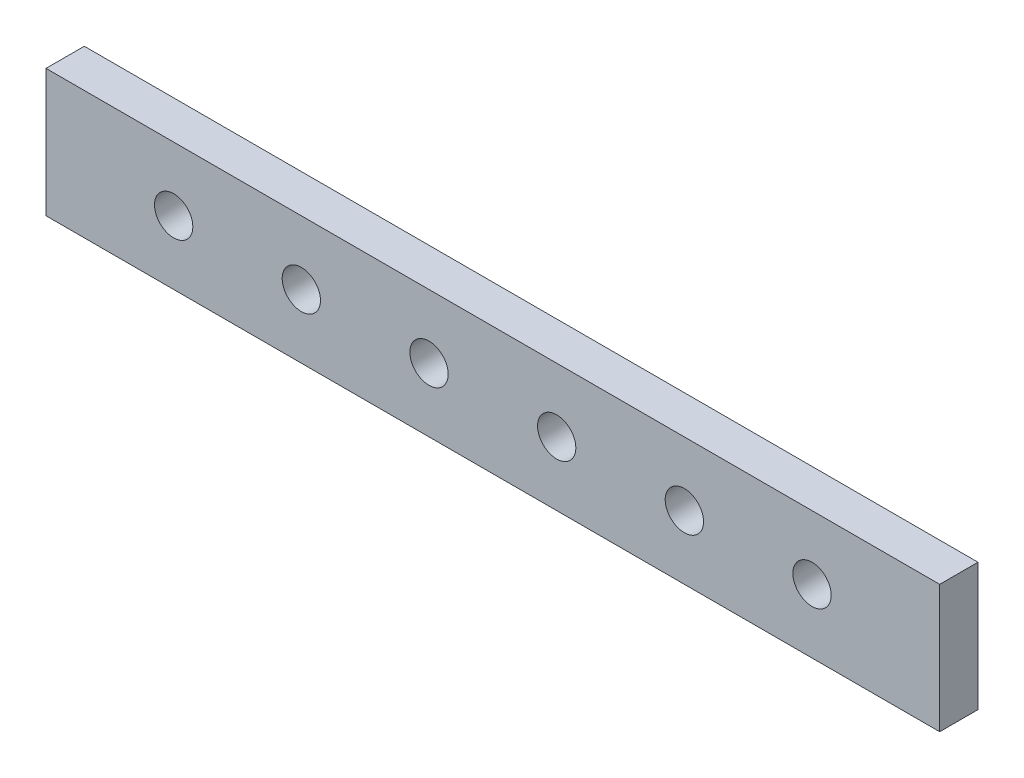
ISO-10303-21;
HEADER;
FILE_DESCRIPTION(('STEP AP214'),'2;1');
FILE_NAME('part.step','',(''),(''),'','','');
FILE_SCHEMA(('AUTOMOTIVE_DESIGN { 1 0 10303 214 1 1 1 1 }'));
ENDSEC;
DATA;
#1=APPLICATION_CONTEXT('core data for automotive mechanical design processes');
#2=APPLICATION_PROTOCOL_DEFINITION('international standard','automotive_design',2000,#1);
#3=PRODUCT_CONTEXT('',#1,'mechanical');
#4=PRODUCT('Part','Part','',(#3));
#5=PRODUCT_RELATED_PRODUCT_CATEGORY('part','',(#4));
#6=PRODUCT_DEFINITION_FORMATION('','',#4);
#7=PRODUCT_DEFINITION_CONTEXT('part definition',#1,'design');
#8=PRODUCT_DEFINITION('design','',#6,#7);
#9=PRODUCT_DEFINITION_SHAPE('','',#8);
#10=(LENGTH_UNIT() NAMED_UNIT(*) SI_UNIT(.MILLI.,.METRE.));
#11=(NAMED_UNIT(*) PLANE_ANGLE_UNIT() SI_UNIT($,.RADIAN.));
#12=(NAMED_UNIT(*) SI_UNIT($,.STERADIAN.) SOLID_ANGLE_UNIT());
#13=UNCERTAINTY_MEASURE_WITH_UNIT(LENGTH_MEASURE(1.E-05),#10,'distance_accuracy_value','');
#14=(GEOMETRIC_REPRESENTATION_CONTEXT(3) GLOBAL_UNCERTAINTY_ASSIGNED_CONTEXT((#13)) GLOBAL_UNIT_ASSIGNED_CONTEXT((#10,
#11,#12)) REPRESENTATION_CONTEXT('',''));
#15=CARTESIAN_POINT('',(0.,0.,0.));
#16=DIRECTION('',(0.,0.,1.));
#17=DIRECTION('',(1.,0.,0.));
#18=AXIS2_PLACEMENT_3D('',#15,#16,#17);
#19=CARTESIAN_POINT('',(0.,0.,3.));
#20=DIRECTION('',(0.,0.,1.));
#21=DIRECTION('',(1.,0.,0.));
#22=AXIS2_PLACEMENT_3D('',#19,#20,#21);
#23=PLANE('',#22);
#24=CARTESIAN_POINT('',(15.,0.,3.));
#25=DIRECTION('',(0.,0.,1.));
#26=DIRECTION('',(1.,0.,0.));
#27=AXIS2_PLACEMENT_3D('',#24,#25,#26);
#28=CIRCLE('',#27,1.5);
#29=CARTESIAN_POINT('',(16.5,0.,3.));
#30=VERTEX_POINT('',#29);
#31=EDGE_CURVE('E133',#30,#30,#28,.T.);
#32=ORIENTED_EDGE('',*,*,#31,.F.);
#33=EDGE_LOOP('',(#32));
#34=FACE_BOUND('',#33,.T.);
#35=CARTESIAN_POINT('',(-5.00000000000001,0.,3.));
#36=DIRECTION('',(0.,0.,1.));
#37=DIRECTION('',(1.,0.,0.));
#38=AXIS2_PLACEMENT_3D('',#35,#36,#37);
#39=CIRCLE('',#38,1.5);
#40=CARTESIAN_POINT('',(-3.50000000000001,0.,3.));
#41=VERTEX_POINT('',#40);
#42=EDGE_CURVE('E121',#41,#41,#39,.T.);
#43=ORIENTED_EDGE('',*,*,#42,.F.);
#44=EDGE_LOOP('',(#43));
#45=FACE_BOUND('',#44,.T.);
#46=CARTESIAN_POINT('',(-25.,0.,3.));
#47=DIRECTION('',(0.,0.,1.));
#48=DIRECTION('',(1.,0.,0.));
#49=AXIS2_PLACEMENT_3D('',#46,#47,#48);
#50=CIRCLE('',#49,1.5);
#51=CARTESIAN_POINT('',(-23.5,0.,3.));
#52=VERTEX_POINT('',#51);
#53=EDGE_CURVE('E100',#52,#52,#50,.T.);
#54=ORIENTED_EDGE('',*,*,#53,.F.);
#55=EDGE_LOOP('',(#54));
#56=FACE_BOUND('',#55,.T.);
#57=DIRECTION('',(0.,1.,0.));
#58=VECTOR('',#57,1.);
#59=CARTESIAN_POINT('',(35.,5.,3.));
#60=LINE('',#59,#58);
#61=CARTESIAN_POINT('',(35.,-5.,3.));
#62=VERTEX_POINT('',#61);
#63=CARTESIAN_POINT('',(35.,5.,3.));
#64=VERTEX_POINT('',#63);
#65=EDGE_CURVE('E85',#62,#64,#60,.T.);
#66=ORIENTED_EDGE('',*,*,#65,.T.);
#67=DIRECTION('',(-1.,0.,0.));
#68=VECTOR('',#67,1.);
#69=CARTESIAN_POINT('',(-35.,5.,3.));
#70=LINE('',#69,#68);
#71=CARTESIAN_POINT('',(-35.,5.,3.));
#72=VERTEX_POINT('',#71);
#73=EDGE_CURVE('E80',#64,#72,#70,.T.);
#74=ORIENTED_EDGE('',*,*,#73,.T.);
#75=DIRECTION('',(0.,-1.,0.));
#76=VECTOR('',#75,1.);
#77=CARTESIAN_POINT('',(-35.,5.,3.));
#78=LINE('',#77,#76);
#79=CARTESIAN_POINT('',(-35.,-5.,3.));
#80=VERTEX_POINT('',#79);
#81=EDGE_CURVE('E83',#72,#80,#78,.T.);
#82=ORIENTED_EDGE('',*,*,#81,.T.);
#83=DIRECTION('',(1.,0.,0.));
#84=VECTOR('',#83,1.);
#85=CARTESIAN_POINT('',(-35.,-5.,3.));
#86=LINE('',#85,#84);
#87=EDGE_CURVE('E50',#80,#62,#86,.T.);
#88=ORIENTED_EDGE('',*,*,#87,.T.);
#89=EDGE_LOOP('',(#66,#74,#82,#88));
#90=FACE_BOUND('',#89,.T.);
#91=CARTESIAN_POINT('',(-15.,0.,3.));
#92=DIRECTION('',(0.,0.,1.));
#93=DIRECTION('',(1.,0.,0.));
#94=AXIS2_PLACEMENT_3D('',#91,#92,#93);
#95=CIRCLE('',#94,1.5);
#96=CARTESIAN_POINT('',(-13.5,0.,3.));
#97=VERTEX_POINT('',#96);
#98=EDGE_CURVE('E115',#97,#97,#95,.T.);
#99=ORIENTED_EDGE('',*,*,#98,.F.);
#100=EDGE_LOOP('',(#99));
#101=FACE_BOUND('',#100,.T.);
#102=CARTESIAN_POINT('',(4.99999999999999,0.,3.));
#103=DIRECTION('',(0.,0.,1.));
#104=DIRECTION('',(1.,0.,0.));
#105=AXIS2_PLACEMENT_3D('',#102,#103,#104);
#106=CIRCLE('',#105,1.5);
#107=CARTESIAN_POINT('',(6.49999999999999,0.,3.));
#108=VERTEX_POINT('',#107);
#109=EDGE_CURVE('E127',#108,#108,#106,.T.);
#110=ORIENTED_EDGE('',*,*,#109,.F.);
#111=EDGE_LOOP('',(#110));
#112=FACE_BOUND('',#111,.T.);
#113=CARTESIAN_POINT('',(25.,0.,3.));
#114=DIRECTION('',(0.,0.,1.));
#115=DIRECTION('',(1.,0.,0.));
#116=AXIS2_PLACEMENT_3D('',#113,#114,#115);
#117=CIRCLE('',#116,1.5);
#118=CARTESIAN_POINT('',(26.5,0.,3.));
#119=VERTEX_POINT('',#118);
#120=EDGE_CURVE('E139',#119,#119,#117,.T.);
#121=ORIENTED_EDGE('',*,*,#120,.F.);
#122=EDGE_LOOP('',(#121));
#123=FACE_BOUND('',#122,.T.);
#124=ADVANCED_FACE('F33',(#34,#45,#56,#90,#101,#112,#123),#23,.T.);
#125=CARTESIAN_POINT('',(0.,0.,0.));
#126=DIRECTION('',(0.,0.,1.));
#127=DIRECTION('',(1.,0.,0.));
#128=AXIS2_PLACEMENT_3D('',#125,#126,#127);
#129=PLANE('',#128);
#130=DIRECTION('',(0.,1.,0.));
#131=VECTOR('',#130,1.);
#132=CARTESIAN_POINT('',(35.,5.,0.));
#133=LINE('',#132,#131);
#134=CARTESIAN_POINT('',(35.,-5.,0.));
#135=VERTEX_POINT('',#134);
#136=CARTESIAN_POINT('',(35.,5.,0.));
#137=VERTEX_POINT('',#136);
#138=EDGE_CURVE('E97',#135,#137,#133,.T.);
#139=ORIENTED_EDGE('',*,*,#138,.F.);
#140=DIRECTION('',(1.,0.,0.));
#141=VECTOR('',#140,1.);
#142=CARTESIAN_POINT('',(-35.,-5.,0.));
#143=LINE('',#142,#141);
#144=CARTESIAN_POINT('',(-35.,-5.,0.));
#145=VERTEX_POINT('',#144);
#146=EDGE_CURVE('E73',#145,#135,#143,.T.);
#147=ORIENTED_EDGE('',*,*,#146,.F.);
#148=DIRECTION('',(0.,-1.,0.));
#149=VECTOR('',#148,1.);
#150=CARTESIAN_POINT('',(-35.,5.,0.));
#151=LINE('',#150,#149);
#152=CARTESIAN_POINT('',(-35.,5.,0.));
#153=VERTEX_POINT('',#152);
#154=EDGE_CURVE('E67',#153,#145,#151,.T.);
#155=ORIENTED_EDGE('',*,*,#154,.F.);
#156=DIRECTION('',(-1.,0.,0.));
#157=VECTOR('',#156,1.);
#158=CARTESIAN_POINT('',(-35.,5.,0.));
#159=LINE('',#158,#157);
#160=EDGE_CURVE('E89',#137,#153,#159,.T.);
#161=ORIENTED_EDGE('',*,*,#160,.F.);
#162=EDGE_LOOP('',(#139,#147,#155,#161));
#163=FACE_BOUND('',#162,.T.);
#164=CARTESIAN_POINT('',(-25.,0.,0.));
#165=DIRECTION('',(0.,0.,1.));
#166=DIRECTION('',(1.,0.,0.));
#167=AXIS2_PLACEMENT_3D('',#164,#165,#166);
#168=CIRCLE('',#167,1.5);
#169=CARTESIAN_POINT('',(-23.5,0.,0.));
#170=VERTEX_POINT('',#169);
#171=EDGE_CURVE('E112',#170,#170,#168,.T.);
#172=ORIENTED_EDGE('',*,*,#171,.T.);
#173=EDGE_LOOP('',(#172));
#174=FACE_BOUND('',#173,.T.);
#175=CARTESIAN_POINT('',(-15.,0.,0.));
#176=DIRECTION('',(0.,0.,1.));
#177=DIRECTION('',(1.,0.,0.));
#178=AXIS2_PLACEMENT_3D('',#175,#176,#177);
#179=CIRCLE('',#178,1.5);
#180=CARTESIAN_POINT('',(-13.5,0.,0.));
#181=VERTEX_POINT('',#180);
#182=EDGE_CURVE('E118',#181,#181,#179,.T.);
#183=ORIENTED_EDGE('',*,*,#182,.T.);
#184=EDGE_LOOP('',(#183));
#185=FACE_BOUND('',#184,.T.);
#186=CARTESIAN_POINT('',(-5.00000000000001,0.,0.));
#187=DIRECTION('',(0.,0.,1.));
#188=DIRECTION('',(1.,0.,0.));
#189=AXIS2_PLACEMENT_3D('',#186,#187,#188);
#190=CIRCLE('',#189,1.5);
#191=CARTESIAN_POINT('',(-3.50000000000001,0.,0.));
#192=VERTEX_POINT('',#191);
#193=EDGE_CURVE('E124',#192,#192,#190,.T.);
#194=ORIENTED_EDGE('',*,*,#193,.T.);
#195=EDGE_LOOP('',(#194));
#196=FACE_BOUND('',#195,.T.);
#197=CARTESIAN_POINT('',(4.99999999999999,0.,0.));
#198=DIRECTION('',(0.,0.,1.));
#199=DIRECTION('',(1.,0.,0.));
#200=AXIS2_PLACEMENT_3D('',#197,#198,#199);
#201=CIRCLE('',#200,1.5);
#202=CARTESIAN_POINT('',(6.49999999999999,0.,0.));
#203=VERTEX_POINT('',#202);
#204=EDGE_CURVE('E130',#203,#203,#201,.T.);
#205=ORIENTED_EDGE('',*,*,#204,.T.);
#206=EDGE_LOOP('',(#205));
#207=FACE_BOUND('',#206,.T.);
#208=CARTESIAN_POINT('',(15.,0.,0.));
#209=DIRECTION('',(0.,0.,1.));
#210=DIRECTION('',(1.,0.,0.));
#211=AXIS2_PLACEMENT_3D('',#208,#209,#210);
#212=CIRCLE('',#211,1.5);
#213=CARTESIAN_POINT('',(16.5,0.,0.));
#214=VERTEX_POINT('',#213);
#215=EDGE_CURVE('E136',#214,#214,#212,.T.);
#216=ORIENTED_EDGE('',*,*,#215,.T.);
#217=EDGE_LOOP('',(#216));
#218=FACE_BOUND('',#217,.T.);
#219=CARTESIAN_POINT('',(25.,0.,0.));
#220=DIRECTION('',(0.,0.,1.));
#221=DIRECTION('',(1.,0.,0.));
#222=AXIS2_PLACEMENT_3D('',#219,#220,#221);
#223=CIRCLE('',#222,1.5);
#224=CARTESIAN_POINT('',(26.5,0.,0.));
#225=VERTEX_POINT('',#224);
#226=EDGE_CURVE('E142',#225,#225,#223,.T.);
#227=ORIENTED_EDGE('',*,*,#226,.T.);
#228=EDGE_LOOP('',(#227));
#229=FACE_BOUND('',#228,.T.);
#230=ADVANCED_FACE('F108',(#163,#174,#185,#196,#207,#218,#229),#129,.F.);
#231=CARTESIAN_POINT('',(35.,5.,3.));
#232=DIRECTION('',(-1.,0.,0.));
#233=DIRECTION('',(0.,0.,1.));
#234=AXIS2_PLACEMENT_3D('',#231,#232,#233);
#235=PLANE('',#234);
#236=ORIENTED_EDGE('',*,*,#138,.T.);
#237=DIRECTION('',(0.,0.,-1.));
#238=VECTOR('',#237,1.);
#239=CARTESIAN_POINT('',(35.,5.,3.));
#240=LINE('',#239,#238);
#241=EDGE_CURVE('E11',#64,#137,#240,.T.);
#242=ORIENTED_EDGE('',*,*,#241,.F.);
#243=ORIENTED_EDGE('',*,*,#65,.F.);
#244=DIRECTION('',(0.,0.,-1.));
#245=VECTOR('',#244,1.);
#246=CARTESIAN_POINT('',(35.,-5.,3.));
#247=LINE('',#246,#245);
#248=EDGE_CURVE('E93',#62,#135,#247,.T.);
#249=ORIENTED_EDGE('',*,*,#248,.T.);
#250=EDGE_LOOP('',(#236,#242,#243,#249));
#251=FACE_BOUND('',#250,.T.);
#252=ADVANCED_FACE('F35',(#251),#235,.F.);
#253=CARTESIAN_POINT('',(-35.,5.,3.));
#254=DIRECTION('',(0.,-1.,0.));
#255=DIRECTION('',(1.,0.,0.));
#256=AXIS2_PLACEMENT_3D('',#253,#254,#255);
#257=PLANE('',#256);
#258=ORIENTED_EDGE('',*,*,#160,.T.);
#259=DIRECTION('',(0.,0.,-1.));
#260=VECTOR('',#259,1.);
#261=CARTESIAN_POINT('',(-35.,5.,3.));
#262=LINE('',#261,#260);
#263=EDGE_CURVE('E42',#72,#153,#262,.T.);
#264=ORIENTED_EDGE('',*,*,#263,.F.);
#265=ORIENTED_EDGE('',*,*,#73,.F.);
#266=ORIENTED_EDGE('',*,*,#241,.T.);
#267=EDGE_LOOP('',(#258,#264,#265,#266));
#268=FACE_BOUND('',#267,.T.);
#269=ADVANCED_FACE('F88',(#268),#257,.F.);
#270=CARTESIAN_POINT('',(-35.,5.,3.));
#271=DIRECTION('',(1.,0.,0.));
#272=DIRECTION('',(0.,0.,-1.));
#273=AXIS2_PLACEMENT_3D('',#270,#271,#272);
#274=PLANE('',#273);
#275=ORIENTED_EDGE('',*,*,#154,.T.);
#276=DIRECTION('',(0.,0.,-1.));
#277=VECTOR('',#276,1.);
#278=CARTESIAN_POINT('',(-35.,-5.,3.));
#279=LINE('',#278,#277);
#280=EDGE_CURVE('E90',#80,#145,#279,.T.);
#281=ORIENTED_EDGE('',*,*,#280,.F.);
#282=ORIENTED_EDGE('',*,*,#81,.F.);
#283=ORIENTED_EDGE('',*,*,#263,.T.);
#284=EDGE_LOOP('',(#275,#281,#282,#283));
#285=FACE_BOUND('',#284,.T.);
#286=ADVANCED_FACE('F91',(#285),#274,.F.);
#287=CARTESIAN_POINT('',(-35.,-5.,3.));
#288=DIRECTION('',(0.,1.,0.));
#289=DIRECTION('',(-1.,0.,0.));
#290=AXIS2_PLACEMENT_3D('',#287,#288,#289);
#291=PLANE('',#290);
#292=ORIENTED_EDGE('',*,*,#146,.T.);
#293=ORIENTED_EDGE('',*,*,#248,.F.);
#294=ORIENTED_EDGE('',*,*,#87,.F.);
#295=ORIENTED_EDGE('',*,*,#280,.T.);
#296=EDGE_LOOP('',(#292,#293,#294,#295));
#297=FACE_BOUND('',#296,.T.);
#298=ADVANCED_FACE('F105',(#297),#291,.F.);
#299=CARTESIAN_POINT('',(-25.,0.,3.));
#300=DIRECTION('',(0.,0.,-1.));
#301=DIRECTION('',(-1.,0.,0.));
#302=AXIS2_PLACEMENT_3D('',#299,#300,#301);
#303=CYLINDRICAL_SURFACE('',#302,1.5);
#304=ORIENTED_EDGE('',*,*,#53,.T.);
#305=EDGE_LOOP('',(#304));
#306=FACE_BOUND('',#305,.T.);
#307=ORIENTED_EDGE('',*,*,#171,.F.);
#308=EDGE_LOOP('',(#307));
#309=FACE_BOUND('',#308,.T.);
#310=ADVANCED_FACE('F161',(#306,#309),#303,.F.);
#311=CARTESIAN_POINT('',(-15.,0.,3.));
#312=DIRECTION('',(0.,0.,-1.));
#313=DIRECTION('',(-1.,0.,0.));
#314=AXIS2_PLACEMENT_3D('',#311,#312,#313);
#315=CYLINDRICAL_SURFACE('',#314,1.5);
#316=ORIENTED_EDGE('',*,*,#98,.T.);
#317=EDGE_LOOP('',(#316));
#318=FACE_BOUND('',#317,.T.);
#319=ORIENTED_EDGE('',*,*,#182,.F.);
#320=EDGE_LOOP('',(#319));
#321=FACE_BOUND('',#320,.T.);
#322=ADVANCED_FACE('F207',(#318,#321),#315,.F.);
#323=CARTESIAN_POINT('',(-5.00000000000001,0.,3.));
#324=DIRECTION('',(0.,0.,-1.));
#325=DIRECTION('',(-1.,0.,0.));
#326=AXIS2_PLACEMENT_3D('',#323,#324,#325);
#327=CYLINDRICAL_SURFACE('',#326,1.5);
#328=ORIENTED_EDGE('',*,*,#42,.T.);
#329=EDGE_LOOP('',(#328));
#330=FACE_BOUND('',#329,.T.);
#331=ORIENTED_EDGE('',*,*,#193,.F.);
#332=EDGE_LOOP('',(#331));
#333=FACE_BOUND('',#332,.T.);
#334=ADVANCED_FACE('F215',(#330,#333),#327,.F.);
#335=CARTESIAN_POINT('',(4.99999999999999,0.,3.));
#336=DIRECTION('',(0.,0.,-1.));
#337=DIRECTION('',(-1.,0.,0.));
#338=AXIS2_PLACEMENT_3D('',#335,#336,#337);
#339=CYLINDRICAL_SURFACE('',#338,1.5);
#340=ORIENTED_EDGE('',*,*,#109,.T.);
#341=EDGE_LOOP('',(#340));
#342=FACE_BOUND('',#341,.T.);
#343=ORIENTED_EDGE('',*,*,#204,.F.);
#344=EDGE_LOOP('',(#343));
#345=FACE_BOUND('',#344,.T.);
#346=ADVANCED_FACE('F223',(#342,#345),#339,.F.);
#347=CARTESIAN_POINT('',(15.,0.,3.));
#348=DIRECTION('',(0.,0.,-1.));
#349=DIRECTION('',(-1.,0.,0.));
#350=AXIS2_PLACEMENT_3D('',#347,#348,#349);
#351=CYLINDRICAL_SURFACE('',#350,1.5);
#352=ORIENTED_EDGE('',*,*,#31,.T.);
#353=EDGE_LOOP('',(#352));
#354=FACE_BOUND('',#353,.T.);
#355=ORIENTED_EDGE('',*,*,#215,.F.);
#356=EDGE_LOOP('',(#355));
#357=FACE_BOUND('',#356,.T.);
#358=ADVANCED_FACE('F232',(#354,#357),#351,.F.);
#359=CARTESIAN_POINT('',(25.,0.,3.));
#360=DIRECTION('',(0.,0.,-1.));
#361=DIRECTION('',(-1.,0.,0.));
#362=AXIS2_PLACEMENT_3D('',#359,#360,#361);
#363=CYLINDRICAL_SURFACE('',#362,1.5);
#364=ORIENTED_EDGE('',*,*,#120,.T.);
#365=EDGE_LOOP('',(#364));
#366=FACE_BOUND('',#365,.T.);
#367=ORIENTED_EDGE('',*,*,#226,.F.);
#368=EDGE_LOOP('',(#367));
#369=FACE_BOUND('',#368,.T.);
#370=ADVANCED_FACE('F148',(#366,#369),#363,.F.);
#371=CLOSED_SHELL('',(#124,#230,#252,#269,#286,#298,#310,#322,#334,#346,#358,#370));
#372=MANIFOLD_SOLID_BREP('B2',#371);
#373=ADVANCED_BREP_SHAPE_REPRESENTATION('',(#18,#372),#14);
#374=SHAPE_DEFINITION_REPRESENTATION(#9,#373);
ENDSEC;
END-ISO-10303-21;
